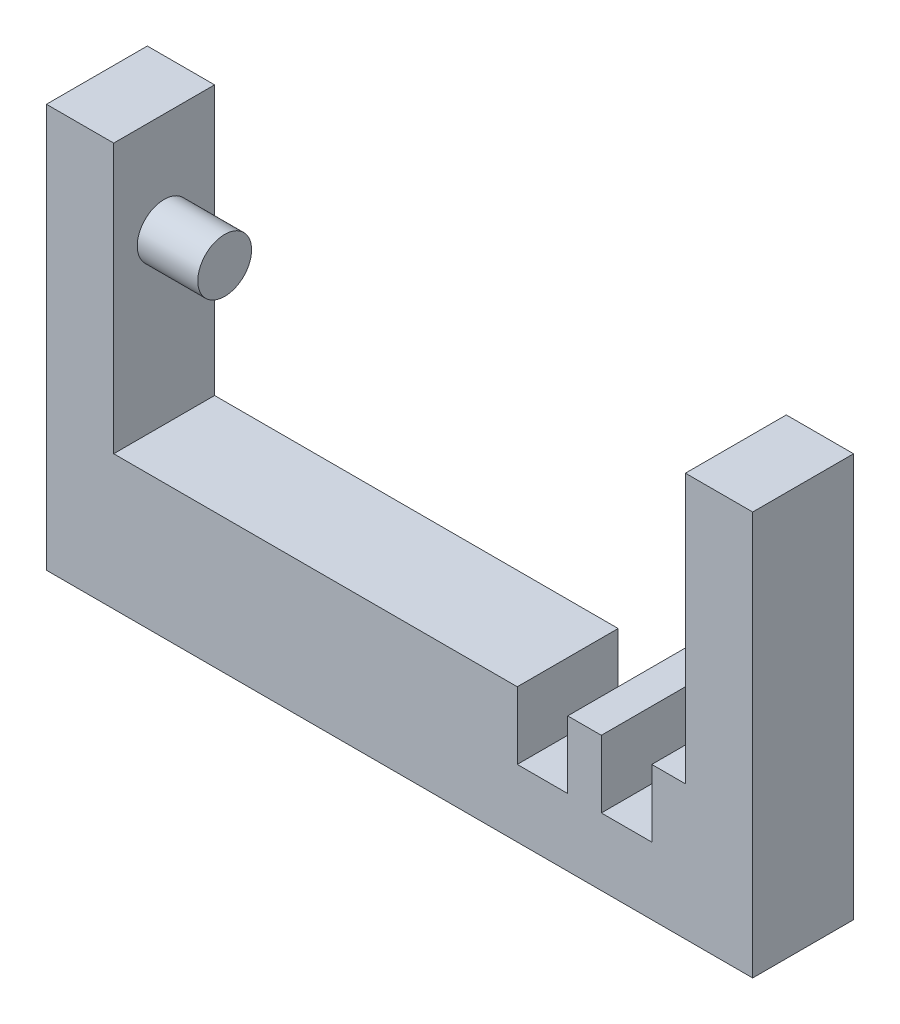
ISO-10303-21;
HEADER;
FILE_DESCRIPTION(('STEP AP214'),'2;1');
FILE_NAME('part.step','',(''),(''),'','','');
FILE_SCHEMA(('AUTOMOTIVE_DESIGN { 1 0 10303 214 1 1 1 1 }'));
ENDSEC;
DATA;
#1=APPLICATION_CONTEXT('core data for automotive mechanical design processes');
#2=APPLICATION_PROTOCOL_DEFINITION('international standard','automotive_design',2000,#1);
#3=PRODUCT_CONTEXT('',#1,'mechanical');
#4=PRODUCT('Part','Part','',(#3));
#5=PRODUCT_RELATED_PRODUCT_CATEGORY('part','',(#4));
#6=PRODUCT_DEFINITION_FORMATION('','',#4);
#7=PRODUCT_DEFINITION_CONTEXT('part definition',#1,'design');
#8=PRODUCT_DEFINITION('design','',#6,#7);
#9=PRODUCT_DEFINITION_SHAPE('','',#8);
#10=(LENGTH_UNIT() NAMED_UNIT(*) SI_UNIT(.MILLI.,.METRE.));
#11=(NAMED_UNIT(*) PLANE_ANGLE_UNIT() SI_UNIT($,.RADIAN.));
#12=(NAMED_UNIT(*) SI_UNIT($,.STERADIAN.) SOLID_ANGLE_UNIT());
#13=UNCERTAINTY_MEASURE_WITH_UNIT(LENGTH_MEASURE(1.E-05),#10,'distance_accuracy_value','');
#14=(GEOMETRIC_REPRESENTATION_CONTEXT(3) GLOBAL_UNCERTAINTY_ASSIGNED_CONTEXT((#13)) GLOBAL_UNIT_ASSIGNED_CONTEXT((#10,
#11,#12)) REPRESENTATION_CONTEXT('',''));
#15=CARTESIAN_POINT('',(0.,0.,0.));
#16=DIRECTION('',(0.,0.,1.));
#17=DIRECTION('',(1.,0.,0.));
#18=AXIS2_PLACEMENT_3D('',#15,#16,#17);
#19=CARTESIAN_POINT('',(0.,10.,-7.5));
#20=DIRECTION('',(0.,0.,-1.));
#21=DIRECTION('',(-1.,0.,0.));
#22=AXIS2_PLACEMENT_3D('',#19,#20,#21);
#23=PLANE('',#22);
#24=DIRECTION('',(-1.,0.,0.));
#25=VECTOR('',#24,1.);
#26=CARTESIAN_POINT('',(32.5,15.,-7.5));
#27=LINE('',#26,#25);
#28=CARTESIAN_POINT('',(32.5,15.,-7.5));
#29=VERTEX_POINT('',#28);
#30=CARTESIAN_POINT('',(27.5,15.,-7.5));
#31=VERTEX_POINT('',#30);
#32=EDGE_CURVE('E55',#29,#31,#27,.T.);
#33=ORIENTED_EDGE('',*,*,#32,.F.);
#34=DIRECTION('',(0.,-1.,0.));
#35=VECTOR('',#34,1.);
#36=CARTESIAN_POINT('',(32.5,20.,-7.5));
#37=LINE('',#36,#35);
#38=CARTESIAN_POINT('',(32.5,10.,-7.5));
#39=VERTEX_POINT('',#38);
#40=EDGE_CURVE('E288',#29,#39,#37,.T.);
#41=ORIENTED_EDGE('',*,*,#40,.T.);
#42=DIRECTION('',(1.,0.,0.));
#43=VECTOR('',#42,1.);
#44=CARTESIAN_POINT('',(0.,10.,-7.5));
#45=LINE('',#44,#43);
#46=CARTESIAN_POINT('',(40.,10.,-7.5));
#47=VERTEX_POINT('',#46);
#48=EDGE_CURVE('E301',#39,#47,#45,.T.);
#49=ORIENTED_EDGE('',*,*,#48,.T.);
#50=DIRECTION('',(0.,-1.,0.));
#51=VECTOR('',#50,1.);
#52=CARTESIAN_POINT('',(40.,20.,-7.5));
#53=LINE('',#52,#51);
#54=CARTESIAN_POINT('',(40.,20.,-7.5));
#55=VERTEX_POINT('',#54);
#56=EDGE_CURVE('E254',#55,#47,#53,.T.);
#57=ORIENTED_EDGE('',*,*,#56,.F.);
#58=DIRECTION('',(1.,0.,0.));
#59=VECTOR('',#58,1.);
#60=CARTESIAN_POINT('',(0.,20.,-7.49999999999997));
#61=LINE('',#60,#59);
#62=CARTESIAN_POINT('',(45.,20.,-7.5));
#63=VERTEX_POINT('',#62);
#64=EDGE_CURVE('E246',#55,#63,#61,.T.);
#65=ORIENTED_EDGE('',*,*,#64,.T.);
#66=DIRECTION('',(0.,-1.,0.));
#67=VECTOR('',#66,1.);
#68=CARTESIAN_POINT('',(45.,60.,-7.5));
#69=LINE('',#68,#67);
#70=CARTESIAN_POINT('',(45.,60.,-7.5));
#71=VERTEX_POINT('',#70);
#72=EDGE_CURVE('E213',#71,#63,#69,.T.);
#73=ORIENTED_EDGE('',*,*,#72,.F.);
#74=DIRECTION('',(1.,0.,0.));
#75=VECTOR('',#74,1.);
#76=CARTESIAN_POINT('',(0.,60.,-7.5));
#77=LINE('',#76,#75);
#78=CARTESIAN_POINT('',(55.,60.,-7.5));
#79=VERTEX_POINT('',#78);
#80=EDGE_CURVE('E205',#71,#79,#77,.T.);
#81=ORIENTED_EDGE('',*,*,#80,.T.);
#82=DIRECTION('',(0.,-1.,0.));
#83=VECTOR('',#82,1.);
#84=CARTESIAN_POINT('',(55.,60.,-7.5));
#85=LINE('',#84,#83);
#86=CARTESIAN_POINT('',(55.,0.,-7.5));
#87=VERTEX_POINT('',#86);
#88=EDGE_CURVE('E216',#79,#87,#85,.T.);
#89=ORIENTED_EDGE('',*,*,#88,.T.);
#90=DIRECTION('',(1.,0.,0.));
#91=VECTOR('',#90,1.);
#92=CARTESIAN_POINT('',(0.,0.,-7.5));
#93=LINE('',#92,#91);
#94=CARTESIAN_POINT('',(-50.,0.,-7.5));
#95=VERTEX_POINT('',#94);
#96=EDGE_CURVE('E297',#95,#87,#93,.T.);
#97=ORIENTED_EDGE('',*,*,#96,.F.);
#98=DIRECTION('',(0.,-1.,0.));
#99=VECTOR('',#98,1.);
#100=CARTESIAN_POINT('',(-50.,60.,-7.5));
#101=LINE('',#100,#99);
#102=CARTESIAN_POINT('',(-50.,60.,-7.5));
#103=VERTEX_POINT('',#102);
#104=EDGE_CURVE('E591',#103,#95,#101,.T.);
#105=ORIENTED_EDGE('',*,*,#104,.F.);
#106=DIRECTION('',(-1.,0.,0.));
#107=VECTOR('',#106,1.);
#108=CARTESIAN_POINT('',(0.,60.,-7.5));
#109=LINE('',#108,#107);
#110=CARTESIAN_POINT('',(-40.,60.,-7.5));
#111=VERTEX_POINT('',#110);
#112=EDGE_CURVE('E183',#111,#103,#109,.T.);
#113=ORIENTED_EDGE('',*,*,#112,.F.);
#114=DIRECTION('',(0.,-1.,0.));
#115=VECTOR('',#114,1.);
#116=CARTESIAN_POINT('',(-40.,60.,-7.5));
#117=LINE('',#116,#115);
#118=CARTESIAN_POINT('',(-40.,20.,-7.5));
#119=VERTEX_POINT('',#118);
#120=EDGE_CURVE('E196',#111,#119,#117,.T.);
#121=ORIENTED_EDGE('',*,*,#120,.T.);
#122=DIRECTION('',(1.,0.,0.));
#123=VECTOR('',#122,1.);
#124=CARTESIAN_POINT('',(0.,20.,-7.5));
#125=LINE('',#124,#123);
#126=CARTESIAN_POINT('',(20.,20.,-7.5));
#127=VERTEX_POINT('',#126);
#128=EDGE_CURVE('E260',#119,#127,#125,.T.);
#129=ORIENTED_EDGE('',*,*,#128,.T.);
#130=DIRECTION('',(0.,-1.,0.));
#131=VECTOR('',#130,1.);
#132=CARTESIAN_POINT('',(20.,20.,-7.5));
#133=LINE('',#132,#131);
#134=CARTESIAN_POINT('',(20.,10.,-7.5));
#135=VERTEX_POINT('',#134);
#136=EDGE_CURVE('E270',#127,#135,#133,.T.);
#137=ORIENTED_EDGE('',*,*,#136,.T.);
#138=DIRECTION('',(1.,0.,0.));
#139=VECTOR('',#138,1.);
#140=CARTESIAN_POINT('',(0.,10.,-7.5));
#141=LINE('',#140,#139);
#142=CARTESIAN_POINT('',(27.5,10.,-7.5));
#143=VERTEX_POINT('',#142);
#144=EDGE_CURVE('E273',#135,#143,#141,.T.);
#145=ORIENTED_EDGE('',*,*,#144,.T.);
#146=DIRECTION('',(0.,-1.,0.));
#147=VECTOR('',#146,1.);
#148=CARTESIAN_POINT('',(27.5,20.,-7.5));
#149=LINE('',#148,#147);
#150=EDGE_CURVE('E295',#31,#143,#149,.T.);
#151=ORIENTED_EDGE('',*,*,#150,.F.);
#152=EDGE_LOOP('',(#33,#41,#49,#57,#65,#73,#81,#89,#97,#105,#113,#121,#129,#137,#145,#151));
#153=FACE_BOUND('',#152,.T.);
#154=ADVANCED_FACE('F39',(#153),#23,.T.);
#155=CARTESIAN_POINT('',(0.,10.,7.5));
#156=DIRECTION('',(0.,0.,-1.));
#157=DIRECTION('',(-1.,0.,0.));
#158=AXIS2_PLACEMENT_3D('',#155,#156,#157);
#159=PLANE('',#158);
#160=DIRECTION('',(1.,0.,0.));
#161=VECTOR('',#160,1.);
#162=CARTESIAN_POINT('',(0.,0.,7.5));
#163=LINE('',#162,#161);
#164=CARTESIAN_POINT('',(-50.,0.,7.5));
#165=VERTEX_POINT('',#164);
#166=CARTESIAN_POINT('',(55.,0.,7.5));
#167=VERTEX_POINT('',#166);
#168=EDGE_CURVE('E42',#165,#167,#163,.T.);
#169=ORIENTED_EDGE('',*,*,#168,.T.);
#170=DIRECTION('',(0.,-1.,0.));
#171=VECTOR('',#170,1.);
#172=CARTESIAN_POINT('',(55.,60.,7.5));
#173=LINE('',#172,#171);
#174=CARTESIAN_POINT('',(55.,60.,7.5));
#175=VERTEX_POINT('',#174);
#176=EDGE_CURVE('E219',#175,#167,#173,.T.);
#177=ORIENTED_EDGE('',*,*,#176,.F.);
#178=DIRECTION('',(-1.,0.,0.));
#179=VECTOR('',#178,1.);
#180=CARTESIAN_POINT('',(0.,60.,7.5));
#181=LINE('',#180,#179);
#182=CARTESIAN_POINT('',(45.,60.,7.5));
#183=VERTEX_POINT('',#182);
#184=EDGE_CURVE('E194',#175,#183,#181,.T.);
#185=ORIENTED_EDGE('',*,*,#184,.T.);
#186=DIRECTION('',(0.,-1.,0.));
#187=VECTOR('',#186,1.);
#188=CARTESIAN_POINT('',(45.,60.,7.5));
#189=LINE('',#188,#187);
#190=CARTESIAN_POINT('',(45.,20.,7.5));
#191=VERTEX_POINT('',#190);
#192=EDGE_CURVE('E209',#183,#191,#189,.T.);
#193=ORIENTED_EDGE('',*,*,#192,.T.);
#194=DIRECTION('',(-1.,0.,0.));
#195=VECTOR('',#194,1.);
#196=CARTESIAN_POINT('',(0.,20.,7.50000000000002));
#197=LINE('',#196,#195);
#198=CARTESIAN_POINT('',(40.,20.,7.5));
#199=VERTEX_POINT('',#198);
#200=EDGE_CURVE('E240',#191,#199,#197,.T.);
#201=ORIENTED_EDGE('',*,*,#200,.T.);
#202=DIRECTION('',(0.,-1.,0.));
#203=VECTOR('',#202,1.);
#204=CARTESIAN_POINT('',(40.,20.,7.5));
#205=LINE('',#204,#203);
#206=CARTESIAN_POINT('',(40.,10.,7.5));
#207=VERTEX_POINT('',#206);
#208=EDGE_CURVE('E251',#199,#207,#205,.T.);
#209=ORIENTED_EDGE('',*,*,#208,.T.);
#210=DIRECTION('',(1.,0.,0.));
#211=VECTOR('',#210,1.);
#212=CARTESIAN_POINT('',(0.,10.,7.5));
#213=LINE('',#212,#211);
#214=CARTESIAN_POINT('',(32.5,10.,7.5));
#215=VERTEX_POINT('',#214);
#216=EDGE_CURVE('E11',#215,#207,#213,.T.);
#217=ORIENTED_EDGE('',*,*,#216,.F.);
#218=DIRECTION('',(0.,-1.,0.));
#219=VECTOR('',#218,1.);
#220=CARTESIAN_POINT('',(32.5,20.,7.5));
#221=LINE('',#220,#219);
#222=CARTESIAN_POINT('',(32.5,20.,7.5));
#223=VERTEX_POINT('',#222);
#224=EDGE_CURVE('E290',#223,#215,#221,.T.);
#225=ORIENTED_EDGE('',*,*,#224,.F.);
#226=DIRECTION('',(1.,0.,0.));
#227=VECTOR('',#226,1.);
#228=CARTESIAN_POINT('',(0.,20.,7.5));
#229=LINE('',#228,#227);
#230=CARTESIAN_POINT('',(27.5,20.,7.5));
#231=VERTEX_POINT('',#230);
#232=EDGE_CURVE('E283',#231,#223,#229,.T.);
#233=ORIENTED_EDGE('',*,*,#232,.F.);
#234=DIRECTION('',(0.,-1.,0.));
#235=VECTOR('',#234,1.);
#236=CARTESIAN_POINT('',(27.5,20.,7.5));
#237=LINE('',#236,#235);
#238=CARTESIAN_POINT('',(27.5,10.,7.5));
#239=VERTEX_POINT('',#238);
#240=EDGE_CURVE('E292',#231,#239,#237,.T.);
#241=ORIENTED_EDGE('',*,*,#240,.T.);
#242=DIRECTION('',(1.,0.,0.));
#243=VECTOR('',#242,1.);
#244=CARTESIAN_POINT('',(0.,10.,7.5));
#245=LINE('',#244,#243);
#246=CARTESIAN_POINT('',(20.,10.,7.5));
#247=VERTEX_POINT('',#246);
#248=EDGE_CURVE('E63',#247,#239,#245,.T.);
#249=ORIENTED_EDGE('',*,*,#248,.F.);
#250=DIRECTION('',(0.,-1.,0.));
#251=VECTOR('',#250,1.);
#252=CARTESIAN_POINT('',(20.,20.,7.5));
#253=LINE('',#252,#251);
#254=CARTESIAN_POINT('',(20.,20.,7.5));
#255=VERTEX_POINT('',#254);
#256=EDGE_CURVE('E268',#255,#247,#253,.T.);
#257=ORIENTED_EDGE('',*,*,#256,.F.);
#258=DIRECTION('',(1.,0.,0.));
#259=VECTOR('',#258,1.);
#260=CARTESIAN_POINT('',(0.,20.,7.5));
#261=LINE('',#260,#259);
#262=CARTESIAN_POINT('',(-40.,20.,7.5));
#263=VERTEX_POINT('',#262);
#264=EDGE_CURVE('E266',#263,#255,#261,.T.);
#265=ORIENTED_EDGE('',*,*,#264,.F.);
#266=DIRECTION('',(0.,-1.,0.));
#267=VECTOR('',#266,1.);
#268=CARTESIAN_POINT('',(-40.,60.,7.5));
#269=LINE('',#268,#267);
#270=CARTESIAN_POINT('',(-40.,60.,7.5));
#271=VERTEX_POINT('',#270);
#272=EDGE_CURVE('E173',#271,#263,#269,.T.);
#273=ORIENTED_EDGE('',*,*,#272,.F.);
#274=DIRECTION('',(1.,0.,0.));
#275=VECTOR('',#274,1.);
#276=CARTESIAN_POINT('',(0.,60.,7.5));
#277=LINE('',#276,#275);
#278=CARTESIAN_POINT('',(-50.,60.,7.5));
#279=VERTEX_POINT('',#278);
#280=EDGE_CURVE('E166',#279,#271,#277,.T.);
#281=ORIENTED_EDGE('',*,*,#280,.F.);
#282=DIRECTION('',(0.,-1.,0.));
#283=VECTOR('',#282,1.);
#284=CARTESIAN_POINT('',(-50.,60.,7.5));
#285=LINE('',#284,#283);
#286=EDGE_CURVE('E170',#279,#165,#285,.T.);
#287=ORIENTED_EDGE('',*,*,#286,.T.);
#288=EDGE_LOOP('',(#169,#177,#185,#193,#201,#209,#217,#225,#233,#241,#249,#257,#265,#273,#281,#287));
#289=FACE_BOUND('',#288,.T.);
#290=ADVANCED_FACE('F168',(#289),#159,.F.);
#291=CARTESIAN_POINT('',(0.,10.,0.));
#292=DIRECTION('',(0.,1.,0.));
#293=DIRECTION('',(0.,0.,1.));
#294=AXIS2_PLACEMENT_3D('',#291,#292,#293);
#295=PLANE('',#294);
#296=DIRECTION('',(0.,0.,1.));
#297=VECTOR('',#296,1.);
#298=CARTESIAN_POINT('',(40.,10.,0.));
#299=LINE('',#298,#297);
#300=EDGE_CURVE('E298',#47,#207,#299,.T.);
#301=ORIENTED_EDGE('',*,*,#300,.F.);
#302=ORIENTED_EDGE('',*,*,#48,.F.);
#303=DIRECTION('',(0.,0.,1.));
#304=VECTOR('',#303,1.);
#305=CARTESIAN_POINT('',(32.5,10.,0.));
#306=LINE('',#305,#304);
#307=EDGE_CURVE('E47',#39,#215,#306,.T.);
#308=ORIENTED_EDGE('',*,*,#307,.T.);
#309=ORIENTED_EDGE('',*,*,#216,.T.);
#310=EDGE_LOOP('',(#301,#302,#308,#309));
#311=FACE_BOUND('',#310,.T.);
#312=ADVANCED_FACE('F314',(#311),#295,.T.);
#313=CARTESIAN_POINT('',(0.,0.,0.));
#314=DIRECTION('',(0.,1.,0.));
#315=DIRECTION('',(0.,0.,1.));
#316=AXIS2_PLACEMENT_3D('',#313,#314,#315);
#317=PLANE('',#316);
#318=ORIENTED_EDGE('',*,*,#96,.T.);
#319=DIRECTION('',(0.,0.,1.));
#320=VECTOR('',#319,1.);
#321=CARTESIAN_POINT('',(55.,0.,0.));
#322=LINE('',#321,#320);
#323=EDGE_CURVE('E191',#87,#167,#322,.T.);
#324=ORIENTED_EDGE('',*,*,#323,.T.);
#325=ORIENTED_EDGE('',*,*,#168,.F.);
#326=DIRECTION('',(0.,0.,1.));
#327=VECTOR('',#326,1.);
#328=CARTESIAN_POINT('',(-50.,0.,0.));
#329=LINE('',#328,#327);
#330=EDGE_CURVE('E187',#95,#165,#329,.T.);
#331=ORIENTED_EDGE('',*,*,#330,.F.);
#332=EDGE_LOOP('',(#318,#324,#325,#331));
#333=FACE_BOUND('',#332,.T.);
#334=ADVANCED_FACE('F311',(#333),#317,.F.);
#335=CARTESIAN_POINT('',(32.5,20.,0.));
#336=DIRECTION('',(1.,0.,0.));
#337=DIRECTION('',(0.,0.,-1.));
#338=AXIS2_PLACEMENT_3D('',#335,#336,#337);
#339=PLANE('',#338);
#340=CARTESIAN_POINT('',(32.5,17.5,-10.));
#341=DIRECTION('',(1.,0.,0.));
#342=DIRECTION('',(0.,0.,-1.));
#343=AXIS2_PLACEMENT_3D('',#340,#341,#342);
#344=CIRCLE('',#343,1.5);
#345=CARTESIAN_POINT('',(32.5,17.5,-11.5));
#346=VERTEX_POINT('',#345);
#347=EDGE_CURVE('E604',#346,#346,#344,.T.);
#348=ORIENTED_EDGE('',*,*,#347,.F.);
#349=EDGE_LOOP('',(#348));
#350=FACE_BOUND('',#349,.T.);
#351=ORIENTED_EDGE('',*,*,#307,.F.);
#352=ORIENTED_EDGE('',*,*,#40,.F.);
#353=DIRECTION('',(0.,0.,1.));
#354=VECTOR('',#353,1.);
#355=CARTESIAN_POINT('',(32.5,15.,-12.5));
#356=LINE('',#355,#354);
#357=CARTESIAN_POINT('',(32.5,15.,-12.5));
#358=VERTEX_POINT('',#357);
#359=EDGE_CURVE('E237',#358,#29,#356,.T.);
#360=ORIENTED_EDGE('',*,*,#359,.F.);
#361=DIRECTION('',(0.,-1.,0.));
#362=VECTOR('',#361,1.);
#363=CARTESIAN_POINT('',(32.5,20.,-12.5));
#364=LINE('',#363,#362);
#365=CARTESIAN_POINT('',(32.5,20.,-12.5));
#366=VERTEX_POINT('',#365);
#367=EDGE_CURVE('E222',#366,#358,#364,.T.);
#368=ORIENTED_EDGE('',*,*,#367,.F.);
#369=DIRECTION('',(0.,0.,1.));
#370=VECTOR('',#369,1.);
#371=CARTESIAN_POINT('',(32.5,20.,0.));
#372=LINE('',#371,#370);
#373=EDGE_CURVE('E285',#366,#223,#372,.T.);
#374=ORIENTED_EDGE('',*,*,#373,.T.);
#375=ORIENTED_EDGE('',*,*,#224,.T.);
#376=EDGE_LOOP('',(#351,#352,#360,#368,#374,#375));
#377=FACE_BOUND('',#376,.T.);
#378=ADVANCED_FACE('F313',(#350,#377),#339,.T.);
#379=CARTESIAN_POINT('',(27.5,20.,0.));
#380=DIRECTION('',(1.,0.,0.));
#381=DIRECTION('',(0.,0.,-1.));
#382=AXIS2_PLACEMENT_3D('',#379,#380,#381);
#383=PLANE('',#382);
#384=CARTESIAN_POINT('',(27.5,17.5,-10.));
#385=DIRECTION('',(1.,0.,0.));
#386=DIRECTION('',(0.,0.,-1.));
#387=AXIS2_PLACEMENT_3D('',#384,#385,#386);
#388=CIRCLE('',#387,1.5);
#389=CARTESIAN_POINT('',(27.5,17.5,-11.5));
#390=VERTEX_POINT('',#389);
#391=EDGE_CURVE('E601',#390,#390,#388,.T.);
#392=ORIENTED_EDGE('',*,*,#391,.T.);
#393=EDGE_LOOP('',(#392));
#394=FACE_BOUND('',#393,.T.);
#395=DIRECTION('',(0.,0.,1.));
#396=VECTOR('',#395,1.);
#397=CARTESIAN_POINT('',(27.5,20.,0.));
#398=LINE('',#397,#396);
#399=CARTESIAN_POINT('',(27.5,20.,-12.5));
#400=VERTEX_POINT('',#399);
#401=EDGE_CURVE('E281',#400,#231,#398,.T.);
#402=ORIENTED_EDGE('',*,*,#401,.F.);
#403=DIRECTION('',(0.,1.,0.));
#404=VECTOR('',#403,1.);
#405=CARTESIAN_POINT('',(27.5,20.,-12.5));
#406=LINE('',#405,#404);
#407=CARTESIAN_POINT('',(27.5,15.,-12.5));
#408=VERTEX_POINT('',#407);
#409=EDGE_CURVE('E227',#408,#400,#406,.T.);
#410=ORIENTED_EDGE('',*,*,#409,.F.);
#411=DIRECTION('',(0.,0.,1.));
#412=VECTOR('',#411,1.);
#413=CARTESIAN_POINT('',(27.5,15.,-12.5));
#414=LINE('',#413,#412);
#415=EDGE_CURVE('E233',#408,#31,#414,.T.);
#416=ORIENTED_EDGE('',*,*,#415,.T.);
#417=ORIENTED_EDGE('',*,*,#150,.T.);
#418=DIRECTION('',(0.,0.,1.));
#419=VECTOR('',#418,1.);
#420=CARTESIAN_POINT('',(27.5,10.,0.));
#421=LINE('',#420,#419);
#422=EDGE_CURVE('E279',#143,#239,#421,.T.);
#423=ORIENTED_EDGE('',*,*,#422,.T.);
#424=ORIENTED_EDGE('',*,*,#240,.F.);
#425=EDGE_LOOP('',(#402,#410,#416,#417,#423,#424));
#426=FACE_BOUND('',#425,.T.);
#427=ADVANCED_FACE('F320',(#394,#426),#383,.F.);
#428=CARTESIAN_POINT('',(0.,20.,0.));
#429=DIRECTION('',(0.,1.,0.));
#430=DIRECTION('',(0.,0.,1.));
#431=AXIS2_PLACEMENT_3D('',#428,#429,#430);
#432=PLANE('',#431);
#433=ORIENTED_EDGE('',*,*,#373,.F.);
#434=DIRECTION('',(1.,0.,0.));
#435=VECTOR('',#434,1.);
#436=CARTESIAN_POINT('',(32.5,20.,-12.5));
#437=LINE('',#436,#435);
#438=EDGE_CURVE('E230',#400,#366,#437,.T.);
#439=ORIENTED_EDGE('',*,*,#438,.F.);
#440=ORIENTED_EDGE('',*,*,#401,.T.);
#441=ORIENTED_EDGE('',*,*,#232,.T.);
#442=EDGE_LOOP('',(#433,#439,#440,#441));
#443=FACE_BOUND('',#442,.T.);
#444=ADVANCED_FACE('F349',(#443),#432,.T.);
#445=CARTESIAN_POINT('',(0.,10.,0.));
#446=DIRECTION('',(0.,1.,0.));
#447=DIRECTION('',(0.,0.,1.));
#448=AXIS2_PLACEMENT_3D('',#445,#446,#447);
#449=PLANE('',#448);
#450=ORIENTED_EDGE('',*,*,#144,.F.);
#451=DIRECTION('',(0.,0.,1.));
#452=VECTOR('',#451,1.);
#453=CARTESIAN_POINT('',(20.,10.,0.));
#454=LINE('',#453,#452);
#455=EDGE_CURVE('E276',#135,#247,#454,.T.);
#456=ORIENTED_EDGE('',*,*,#455,.T.);
#457=ORIENTED_EDGE('',*,*,#248,.T.);
#458=ORIENTED_EDGE('',*,*,#422,.F.);
#459=EDGE_LOOP('',(#450,#456,#457,#458));
#460=FACE_BOUND('',#459,.T.);
#461=ADVANCED_FACE('F343',(#460),#449,.T.);
#462=CARTESIAN_POINT('',(20.,20.,0.));
#463=DIRECTION('',(1.,0.,0.));
#464=DIRECTION('',(0.,0.,-1.));
#465=AXIS2_PLACEMENT_3D('',#462,#463,#464);
#466=PLANE('',#465);
#467=ORIENTED_EDGE('',*,*,#455,.F.);
#468=ORIENTED_EDGE('',*,*,#136,.F.);
#469=DIRECTION('',(0.,0.,1.));
#470=VECTOR('',#469,1.);
#471=CARTESIAN_POINT('',(20.,20.,0.));
#472=LINE('',#471,#470);
#473=EDGE_CURVE('E257',#127,#255,#472,.T.);
#474=ORIENTED_EDGE('',*,*,#473,.T.);
#475=ORIENTED_EDGE('',*,*,#256,.T.);
#476=EDGE_LOOP('',(#467,#468,#474,#475));
#477=FACE_BOUND('',#476,.T.);
#478=ADVANCED_FACE('F348',(#477),#466,.T.);
#479=CARTESIAN_POINT('',(0.,20.,0.));
#480=DIRECTION('',(0.,1.,0.));
#481=DIRECTION('',(0.,0.,1.));
#482=AXIS2_PLACEMENT_3D('',#479,#480,#481);
#483=PLANE('',#482);
#484=ORIENTED_EDGE('',*,*,#473,.F.);
#485=ORIENTED_EDGE('',*,*,#128,.F.);
#486=DIRECTION('',(0.,0.,1.));
#487=VECTOR('',#486,1.);
#488=CARTESIAN_POINT('',(-40.,20.,0.));
#489=LINE('',#488,#487);
#490=EDGE_CURVE('E263',#119,#263,#489,.T.);
#491=ORIENTED_EDGE('',*,*,#490,.T.);
#492=ORIENTED_EDGE('',*,*,#264,.T.);
#493=EDGE_LOOP('',(#484,#485,#491,#492));
#494=FACE_BOUND('',#493,.T.);
#495=ADVANCED_FACE('F361',(#494),#483,.T.);
#496=CARTESIAN_POINT('',(40.,20.,0.));
#497=DIRECTION('',(1.,0.,0.));
#498=DIRECTION('',(0.,0.,-1.));
#499=AXIS2_PLACEMENT_3D('',#496,#497,#498);
#500=PLANE('',#499);
#501=ORIENTED_EDGE('',*,*,#56,.T.);
#502=ORIENTED_EDGE('',*,*,#300,.T.);
#503=ORIENTED_EDGE('',*,*,#208,.F.);
#504=DIRECTION('',(0.,0.,1.));
#505=VECTOR('',#504,1.);
#506=CARTESIAN_POINT('',(40.,20.,0.));
#507=LINE('',#506,#505);
#508=EDGE_CURVE('E249',#55,#199,#507,.T.);
#509=ORIENTED_EDGE('',*,*,#508,.F.);
#510=EDGE_LOOP('',(#501,#502,#503,#509));
#511=FACE_BOUND('',#510,.T.);
#512=ADVANCED_FACE('F371',(#511),#500,.F.);
#513=CARTESIAN_POINT('',(0.,20.,0.));
#514=DIRECTION('',(0.,1.,0.));
#515=DIRECTION('',(0.,0.,1.));
#516=AXIS2_PLACEMENT_3D('',#513,#514,#515);
#517=PLANE('',#516);
#518=ORIENTED_EDGE('',*,*,#200,.F.);
#519=DIRECTION('',(0.,0.,1.));
#520=VECTOR('',#519,1.);
#521=CARTESIAN_POINT('',(45.,20.,0.));
#522=LINE('',#521,#520);
#523=EDGE_CURVE('E243',#63,#191,#522,.T.);
#524=ORIENTED_EDGE('',*,*,#523,.F.);
#525=ORIENTED_EDGE('',*,*,#64,.F.);
#526=ORIENTED_EDGE('',*,*,#508,.T.);
#527=EDGE_LOOP('',(#518,#524,#525,#526));
#528=FACE_BOUND('',#527,.T.);
#529=ADVANCED_FACE('F376',(#528),#517,.T.);
#530=CARTESIAN_POINT('',(32.5,15.,-12.5));
#531=DIRECTION('',(0.,1.,0.));
#532=DIRECTION('',(0.,0.,1.));
#533=AXIS2_PLACEMENT_3D('',#530,#531,#532);
#534=PLANE('',#533);
#535=ORIENTED_EDGE('',*,*,#32,.T.);
#536=ORIENTED_EDGE('',*,*,#415,.F.);
#537=DIRECTION('',(-1.,0.,0.));
#538=VECTOR('',#537,1.);
#539=CARTESIAN_POINT('',(32.5,15.,-12.5));
#540=LINE('',#539,#538);
#541=EDGE_CURVE('E225',#358,#408,#540,.T.);
#542=ORIENTED_EDGE('',*,*,#541,.F.);
#543=ORIENTED_EDGE('',*,*,#359,.T.);
#544=EDGE_LOOP('',(#535,#536,#542,#543));
#545=FACE_BOUND('',#544,.T.);
#546=ADVANCED_FACE('F396',(#545),#534,.F.);
#547=CARTESIAN_POINT('',(0.,0.,-12.5));
#548=DIRECTION('',(0.,0.,-1.));
#549=DIRECTION('',(-1.,0.,0.));
#550=AXIS2_PLACEMENT_3D('',#547,#548,#549);
#551=PLANE('',#550);
#552=ORIENTED_EDGE('',*,*,#367,.T.);
#553=ORIENTED_EDGE('',*,*,#541,.T.);
#554=ORIENTED_EDGE('',*,*,#409,.T.);
#555=ORIENTED_EDGE('',*,*,#438,.T.);
#556=EDGE_LOOP('',(#552,#553,#554,#555));
#557=FACE_BOUND('',#556,.T.);
#558=ADVANCED_FACE('F400',(#557),#551,.T.);
#559=CARTESIAN_POINT('',(45.,60.,0.));
#560=DIRECTION('',(1.,0.,0.));
#561=DIRECTION('',(0.,0.,-1.));
#562=AXIS2_PLACEMENT_3D('',#559,#560,#561);
#563=PLANE('',#562);
#564=ORIENTED_EDGE('',*,*,#72,.T.);
#565=ORIENTED_EDGE('',*,*,#523,.T.);
#566=ORIENTED_EDGE('',*,*,#192,.F.);
#567=DIRECTION('',(0.,0.,1.));
#568=VECTOR('',#567,1.);
#569=CARTESIAN_POINT('',(45.,60.,0.));
#570=LINE('',#569,#568);
#571=EDGE_CURVE('E208',#71,#183,#570,.T.);
#572=ORIENTED_EDGE('',*,*,#571,.F.);
#573=EDGE_LOOP('',(#564,#565,#566,#572));
#574=FACE_BOUND('',#573,.T.);
#575=ADVANCED_FACE('F410',(#574),#563,.F.);
#576=CARTESIAN_POINT('',(55.,60.,0.));
#577=DIRECTION('',(1.,0.,0.));
#578=DIRECTION('',(0.,0.,-1.));
#579=AXIS2_PLACEMENT_3D('',#576,#577,#578);
#580=PLANE('',#579);
#581=ORIENTED_EDGE('',*,*,#323,.F.);
#582=ORIENTED_EDGE('',*,*,#88,.F.);
#583=DIRECTION('',(0.,0.,1.));
#584=VECTOR('',#583,1.);
#585=CARTESIAN_POINT('',(55.,60.,0.));
#586=LINE('',#585,#584);
#587=EDGE_CURVE('E202',#79,#175,#586,.T.);
#588=ORIENTED_EDGE('',*,*,#587,.T.);
#589=ORIENTED_EDGE('',*,*,#176,.T.);
#590=EDGE_LOOP('',(#581,#582,#588,#589));
#591=FACE_BOUND('',#590,.T.);
#592=ADVANCED_FACE('F309',(#591),#580,.T.);
#593=CARTESIAN_POINT('',(0.,60.,0.));
#594=DIRECTION('',(0.,1.,0.));
#595=DIRECTION('',(0.,0.,1.));
#596=AXIS2_PLACEMENT_3D('',#593,#594,#595);
#597=PLANE('',#596);
#598=ORIENTED_EDGE('',*,*,#184,.F.);
#599=ORIENTED_EDGE('',*,*,#587,.F.);
#600=ORIENTED_EDGE('',*,*,#80,.F.);
#601=ORIENTED_EDGE('',*,*,#571,.T.);
#602=EDGE_LOOP('',(#598,#599,#600,#601));
#603=FACE_BOUND('',#602,.T.);
#604=ADVANCED_FACE('F466',(#603),#597,.T.);
#605=CARTESIAN_POINT('',(-40.,60.,0.));
#606=DIRECTION('',(1.,0.,0.));
#607=DIRECTION('',(0.,0.,-1.));
#608=AXIS2_PLACEMENT_3D('',#605,#606,#607);
#609=PLANE('',#608);
#610=CARTESIAN_POINT('',(-40.,45.,0.));
#611=DIRECTION('',(1.,0.,0.));
#612=DIRECTION('',(0.,0.,-1.));
#613=AXIS2_PLACEMENT_3D('',#610,#611,#612);
#614=CIRCLE('',#613,4.);
#615=CARTESIAN_POINT('',(-40.,45.,-3.99999999999999));
#616=VERTEX_POINT('',#615);
#617=EDGE_CURVE('E598',#616,#616,#614,.T.);
#618=ORIENTED_EDGE('',*,*,#617,.F.);
#619=EDGE_LOOP('',(#618));
#620=FACE_BOUND('',#619,.T.);
#621=ORIENTED_EDGE('',*,*,#490,.F.);
#622=ORIENTED_EDGE('',*,*,#120,.F.);
#623=DIRECTION('',(0.,0.,1.));
#624=VECTOR('',#623,1.);
#625=CARTESIAN_POINT('',(-40.,60.,0.));
#626=LINE('',#625,#624);
#627=EDGE_CURVE('E177',#111,#271,#626,.T.);
#628=ORIENTED_EDGE('',*,*,#627,.T.);
#629=ORIENTED_EDGE('',*,*,#272,.T.);
#630=EDGE_LOOP('',(#621,#622,#628,#629));
#631=FACE_BOUND('',#630,.T.);
#632=ADVANCED_FACE('F476',(#620,#631),#609,.T.);
#633=CARTESIAN_POINT('',(-50.,60.,0.));
#634=DIRECTION('',(1.,0.,0.));
#635=DIRECTION('',(0.,0.,-1.));
#636=AXIS2_PLACEMENT_3D('',#633,#634,#635);
#637=PLANE('',#636);
#638=ORIENTED_EDGE('',*,*,#330,.T.);
#639=ORIENTED_EDGE('',*,*,#286,.F.);
#640=DIRECTION('',(0.,0.,1.));
#641=VECTOR('',#640,1.);
#642=CARTESIAN_POINT('',(-50.,60.,0.));
#643=LINE('',#642,#641);
#644=EDGE_CURVE('E178',#103,#279,#643,.T.);
#645=ORIENTED_EDGE('',*,*,#644,.F.);
#646=ORIENTED_EDGE('',*,*,#104,.T.);
#647=EDGE_LOOP('',(#638,#639,#645,#646));
#648=FACE_BOUND('',#647,.T.);
#649=ADVANCED_FACE('F189',(#648),#637,.F.);
#650=CARTESIAN_POINT('',(0.,60.,0.));
#651=DIRECTION('',(0.,1.,0.));
#652=DIRECTION('',(0.,0.,1.));
#653=AXIS2_PLACEMENT_3D('',#650,#651,#652);
#654=PLANE('',#653);
#655=ORIENTED_EDGE('',*,*,#644,.T.);
#656=ORIENTED_EDGE('',*,*,#280,.T.);
#657=ORIENTED_EDGE('',*,*,#627,.F.);
#658=ORIENTED_EDGE('',*,*,#112,.T.);
#659=EDGE_LOOP('',(#655,#656,#657,#658));
#660=FACE_BOUND('',#659,.T.);
#661=ADVANCED_FACE('F181',(#660),#654,.T.);
#662=CARTESIAN_POINT('',(-31.,45.,0.));
#663=DIRECTION('',(-1.,0.,0.));
#664=DIRECTION('',(0.,0.,1.));
#665=AXIS2_PLACEMENT_3D('',#662,#663,#664);
#666=CYLINDRICAL_SURFACE('',#665,4.);
#667=CARTESIAN_POINT('',(-31.,45.,0.));
#668=DIRECTION('',(1.,0.,0.));
#669=DIRECTION('',(0.,0.,-1.));
#670=AXIS2_PLACEMENT_3D('',#667,#668,#669);
#671=CIRCLE('',#670,4.);
#672=CARTESIAN_POINT('',(-31.,45.,-3.99999999999999));
#673=VERTEX_POINT('',#672);
#674=EDGE_CURVE('E595',#673,#673,#671,.T.);
#675=ORIENTED_EDGE('',*,*,#674,.F.);
#676=EDGE_LOOP('',(#675));
#677=FACE_BOUND('',#676,.T.);
#678=ORIENTED_EDGE('',*,*,#617,.T.);
#679=EDGE_LOOP('',(#678));
#680=FACE_BOUND('',#679,.T.);
#681=ADVANCED_FACE('F507',(#677,#680),#666,.T.);
#682=CARTESIAN_POINT('',(-31.,45.,0.));
#683=DIRECTION('',(1.,0.,0.));
#684=DIRECTION('',(0.,0.,-1.));
#685=AXIS2_PLACEMENT_3D('',#682,#683,#684);
#686=PLANE('',#685);
#687=ORIENTED_EDGE('',*,*,#674,.T.);
#688=EDGE_LOOP('',(#687));
#689=FACE_BOUND('',#688,.T.);
#690=ADVANCED_FACE('F516',(#689),#686,.T.);
#691=CARTESIAN_POINT('',(27.5,17.5,-10.));
#692=DIRECTION('',(1.,0.,0.));
#693=DIRECTION('',(0.,0.,-1.));
#694=AXIS2_PLACEMENT_3D('',#691,#692,#693);
#695=CYLINDRICAL_SURFACE('',#694,1.5);
#696=ORIENTED_EDGE('',*,*,#391,.F.);
#697=EDGE_LOOP('',(#696));
#698=FACE_BOUND('',#697,.T.);
#699=ORIENTED_EDGE('',*,*,#347,.T.);
#700=EDGE_LOOP('',(#699));
#701=FACE_BOUND('',#700,.T.);
#702=ADVANCED_FACE('F527',(#698,#701),#695,.F.);
#703=CLOSED_SHELL('',(#154,#290,#312,#334,#378,#427,#444,#461,#478,#495,#512,#529,#546,#558,
#575,#592,#604,#632,#649,#661,#681,#690,#702));
#704=MANIFOLD_SOLID_BREP('B2',#703);
#705=ADVANCED_BREP_SHAPE_REPRESENTATION('',(#18,#704),#14);
#706=SHAPE_DEFINITION_REPRESENTATION(#9,#705);
ENDSEC;
END-ISO-10303-21;
